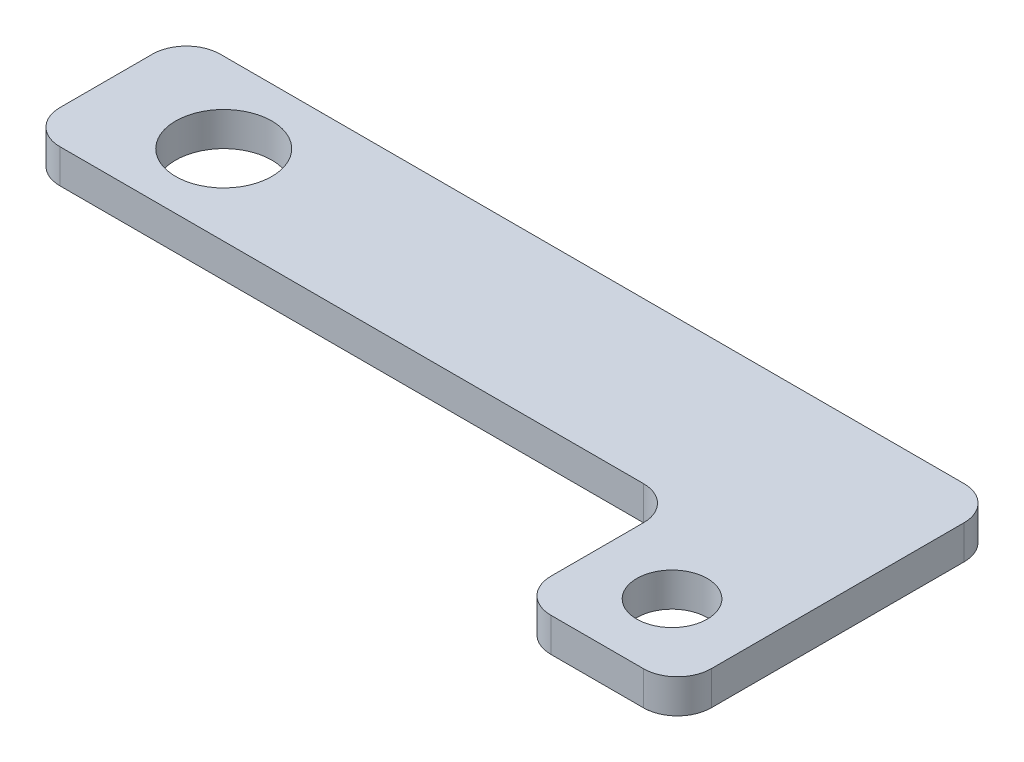
ISO-10303-21;
HEADER;
FILE_DESCRIPTION(('STEP AP214'),'2;1');
FILE_NAME('part.step','',(''),(''),'','','');
FILE_SCHEMA(('AUTOMOTIVE_DESIGN { 1 0 10303 214 1 1 1 1 }'));
ENDSEC;
DATA;
#1=APPLICATION_CONTEXT('core data for automotive mechanical design processes');
#2=APPLICATION_PROTOCOL_DEFINITION('international standard','automotive_design',2000,#1);
#3=PRODUCT_CONTEXT('',#1,'mechanical');
#4=PRODUCT('Part','Part','',(#3));
#5=PRODUCT_RELATED_PRODUCT_CATEGORY('part','',(#4));
#6=PRODUCT_DEFINITION_FORMATION('','',#4);
#7=PRODUCT_DEFINITION_CONTEXT('part definition',#1,'design');
#8=PRODUCT_DEFINITION('design','',#6,#7);
#9=PRODUCT_DEFINITION_SHAPE('','',#8);
#10=(LENGTH_UNIT() NAMED_UNIT(*) SI_UNIT(.MILLI.,.METRE.));
#11=(NAMED_UNIT(*) PLANE_ANGLE_UNIT() SI_UNIT($,.RADIAN.));
#12=(NAMED_UNIT(*) SI_UNIT($,.STERADIAN.) SOLID_ANGLE_UNIT());
#13=UNCERTAINTY_MEASURE_WITH_UNIT(LENGTH_MEASURE(1.E-05),#10,'distance_accuracy_value','');
#14=(GEOMETRIC_REPRESENTATION_CONTEXT(3) GLOBAL_UNCERTAINTY_ASSIGNED_CONTEXT((#13)) GLOBAL_UNIT_ASSIGNED_CONTEXT((#10,
#11,#12)) REPRESENTATION_CONTEXT('',''));
#15=CARTESIAN_POINT('',(0.,0.,0.));
#16=DIRECTION('',(0.,0.,1.));
#17=DIRECTION('',(1.,0.,0.));
#18=AXIS2_PLACEMENT_3D('',#15,#16,#17);
#19=CARTESIAN_POINT('',(56.0000000000009,-3.175,51.0812086000005));
#20=DIRECTION('',(0.,0.,1.));
#21=DIRECTION('',(1.,0.,0.));
#22=AXIS2_PLACEMENT_3D('',#19,#20,#21);
#23=PLANE('',#22);
#24=DIRECTION('',(1.,0.,0.));
#25=VECTOR('',#24,1.);
#26=CARTESIAN_POINT('',(56.0000000000009,-3.175,51.0812086000005));
#27=LINE('',#26,#25);
#28=CARTESIAN_POINT('',(59.1750000000009,-3.175,51.0812086000005));
#29=VERTEX_POINT('',#28);
#30=CARTESIAN_POINT('',(67.8250000000009,-3.175,51.0812086000005));
#31=VERTEX_POINT('',#30);
#32=EDGE_CURVE('E158',#29,#31,#27,.T.);
#33=ORIENTED_EDGE('',*,*,#32,.T.);
#34=DIRECTION('',(0.,1.,0.));
#35=VECTOR('',#34,1.);
#36=CARTESIAN_POINT('',(67.8250000000009,-3.175,51.0812086000005));
#37=LINE('',#36,#35);
#38=CARTESIAN_POINT('',(67.8250000000009,0.,51.0812086000005));
#39=VERTEX_POINT('',#38);
#40=EDGE_CURVE('E202',#31,#39,#37,.T.);
#41=ORIENTED_EDGE('',*,*,#40,.T.);
#42=DIRECTION('',(1.,0.,0.));
#43=VECTOR('',#42,1.);
#44=CARTESIAN_POINT('',(56.0000000000009,0.,51.0812086000005));
#45=LINE('',#44,#43);
#46=CARTESIAN_POINT('',(59.1750000000009,0.,51.0812086000005));
#47=VERTEX_POINT('',#46);
#48=EDGE_CURVE('E136',#47,#39,#45,.T.);
#49=ORIENTED_EDGE('',*,*,#48,.F.);
#50=DIRECTION('',(0.,1.,0.));
#51=VECTOR('',#50,1.);
#52=CARTESIAN_POINT('',(59.1750000000009,-3.175,51.0812086000005));
#53=LINE('',#52,#51);
#54=EDGE_CURVE('E200',#47,#29,#53,.F.);
#55=ORIENTED_EDGE('',*,*,#54,.T.);
#56=EDGE_LOOP('',(#33,#41,#49,#55));
#57=FACE_BOUND('',#56,.T.);
#58=ADVANCED_FACE('F41',(#57),#23,.T.);
#59=CARTESIAN_POINT('',(56.0000000000009,-3.175,44.0812086000005));
#60=DIRECTION('',(-1.,0.,0.));
#61=DIRECTION('',(0.,0.,1.));
#62=AXIS2_PLACEMENT_3D('',#59,#60,#61);
#63=PLANE('',#62);
#64=DIRECTION('',(0.,0.,1.));
#65=VECTOR('',#64,1.);
#66=CARTESIAN_POINT('',(56.0000000000009,0.,44.0812086000005));
#67=LINE('',#66,#65);
#68=CARTESIAN_POINT('',(56.0000000000009,0.,39.2562086000001));
#69=VERTEX_POINT('',#68);
#70=CARTESIAN_POINT('',(56.0000000000009,0.,47.9062086000005));
#71=VERTEX_POINT('',#70);
#72=EDGE_CURVE('E206',#69,#71,#67,.T.);
#73=ORIENTED_EDGE('',*,*,#72,.F.);
#74=DIRECTION('',(0.,1.,0.));
#75=VECTOR('',#74,1.);
#76=CARTESIAN_POINT('',(56.0000000000009,-3.175,39.2562086000001));
#77=LINE('',#76,#75);
#78=CARTESIAN_POINT('',(56.0000000000009,-3.175,39.2562086000001));
#79=VERTEX_POINT('',#78);
#80=EDGE_CURVE('E198',#69,#79,#77,.F.);
#81=ORIENTED_EDGE('',*,*,#80,.T.);
#82=DIRECTION('',(0.,0.,1.));
#83=VECTOR('',#82,1.);
#84=CARTESIAN_POINT('',(56.0000000000009,-3.175,36.0812086000001));
#85=LINE('',#84,#83);
#86=CARTESIAN_POINT('',(56.0000000000009,-3.175,47.9062086000005));
#87=VERTEX_POINT('',#86);
#88=EDGE_CURVE('E162',#79,#87,#85,.T.);
#89=ORIENTED_EDGE('',*,*,#88,.T.);
#90=DIRECTION('',(0.,1.,0.));
#91=VECTOR('',#90,1.);
#92=CARTESIAN_POINT('',(56.0000000000009,-3.175,47.9062086000005));
#93=LINE('',#92,#91);
#94=EDGE_CURVE('E195',#87,#71,#93,.T.);
#95=ORIENTED_EDGE('',*,*,#94,.T.);
#96=EDGE_LOOP('',(#73,#81,#89,#95));
#97=FACE_BOUND('',#96,.T.);
#98=ADVANCED_FACE('F213',(#97),#63,.T.);
#99=CARTESIAN_POINT('',(6.05000000000337,-3.175,36.0812086000001));
#100=DIRECTION('',(0.,0.,1.));
#101=DIRECTION('',(1.,0.,0.));
#102=AXIS2_PLACEMENT_3D('',#99,#100,#101);
#103=PLANE('',#102);
#104=DIRECTION('',(1.,0.,0.));
#105=VECTOR('',#104,1.);
#106=CARTESIAN_POINT('',(6.05000000000337,0.,36.0812086000001));
#107=LINE('',#106,#105);
#108=CARTESIAN_POINT('',(-1.77499999999663,0.,36.0812086000001));
#109=VERTEX_POINT('',#108);
#110=CARTESIAN_POINT('',(52.8250000000009,0.,36.0812086000001));
#111=VERTEX_POINT('',#110);
#112=EDGE_CURVE('E208',#109,#111,#107,.T.);
#113=ORIENTED_EDGE('',*,*,#112,.F.);
#114=DIRECTION('',(0.,1.,0.));
#115=VECTOR('',#114,1.);
#116=CARTESIAN_POINT('',(-1.77499999999663,-3.175,36.0812086000001));
#117=LINE('',#116,#115);
#118=CARTESIAN_POINT('',(-1.77499999999663,-3.175,36.0812086000001));
#119=VERTEX_POINT('',#118);
#120=EDGE_CURVE('E193',#109,#119,#117,.F.);
#121=ORIENTED_EDGE('',*,*,#120,.T.);
#122=DIRECTION('',(1.,0.,0.));
#123=VECTOR('',#122,1.);
#124=CARTESIAN_POINT('',(-4.94999999999663,-3.175,36.0812086000001));
#125=LINE('',#124,#123);
#126=CARTESIAN_POINT('',(52.8250000000009,-3.175,36.0812086000001));
#127=VERTEX_POINT('',#126);
#128=EDGE_CURVE('E222',#119,#127,#125,.T.);
#129=ORIENTED_EDGE('',*,*,#128,.T.);
#130=DIRECTION('',(0.,1.,0.));
#131=VECTOR('',#130,1.);
#132=CARTESIAN_POINT('',(52.8250000000009,0.,36.0812086000001));
#133=LINE('',#132,#131);
#134=EDGE_CURVE('E190',#127,#111,#133,.T.);
#135=ORIENTED_EDGE('',*,*,#134,.T.);
#136=EDGE_LOOP('',(#113,#121,#129,#135));
#137=FACE_BOUND('',#136,.T.);
#138=ADVANCED_FACE('F224',(#137),#103,.T.);
#139=CARTESIAN_POINT('',(-4.94999999999663,-3.175,21.0812086000001));
#140=DIRECTION('',(-1.,0.,0.));
#141=DIRECTION('',(0.,0.,1.));
#142=AXIS2_PLACEMENT_3D('',#139,#140,#141);
#143=PLANE('',#142);
#144=DIRECTION('',(0.,0.,1.));
#145=VECTOR('',#144,1.);
#146=CARTESIAN_POINT('',(-4.94999999999663,0.,21.0812086000001));
#147=LINE('',#146,#145);
#148=CARTESIAN_POINT('',(-4.94999999999663,0.,24.2562086000001));
#149=VERTEX_POINT('',#148);
#150=CARTESIAN_POINT('',(-4.94999999999663,0.,32.9062086000001));
#151=VERTEX_POINT('',#150);
#152=EDGE_CURVE('E235',#149,#151,#147,.T.);
#153=ORIENTED_EDGE('',*,*,#152,.F.);
#154=DIRECTION('',(0.,1.,0.));
#155=VECTOR('',#154,1.);
#156=CARTESIAN_POINT('',(-4.94999999999663,-3.175,24.2562086000001));
#157=LINE('',#156,#155);
#158=CARTESIAN_POINT('',(-4.94999999999663,-3.175,24.2562086000001));
#159=VERTEX_POINT('',#158);
#160=EDGE_CURVE('E63',#149,#159,#157,.F.);
#161=ORIENTED_EDGE('',*,*,#160,.T.);
#162=DIRECTION('',(0.,0.,1.));
#163=VECTOR('',#162,1.);
#164=CARTESIAN_POINT('',(-4.94999999999663,-3.175,21.0812086000001));
#165=LINE('',#164,#163);
#166=CARTESIAN_POINT('',(-4.94999999999663,-3.175,32.9062086000001));
#167=VERTEX_POINT('',#166);
#168=EDGE_CURVE('E226',#159,#167,#165,.T.);
#169=ORIENTED_EDGE('',*,*,#168,.T.);
#170=DIRECTION('',(0.,1.,0.));
#171=VECTOR('',#170,1.);
#172=CARTESIAN_POINT('',(-4.94999999999663,-3.175,32.9062086000001));
#173=LINE('',#172,#171);
#174=EDGE_CURVE('E186',#167,#151,#173,.T.);
#175=ORIENTED_EDGE('',*,*,#174,.T.);
#176=EDGE_LOOP('',(#153,#161,#169,#175));
#177=FACE_BOUND('',#176,.T.);
#178=ADVANCED_FACE('F238',(#177),#143,.T.);
#179=CARTESIAN_POINT('',(6.05000000000337,-3.175,21.0812086000001));
#180=DIRECTION('',(0.,0.,-1.));
#181=DIRECTION('',(-1.,0.,0.));
#182=AXIS2_PLACEMENT_3D('',#179,#180,#181);
#183=PLANE('',#182);
#184=DIRECTION('',(-1.,0.,0.));
#185=VECTOR('',#184,1.);
#186=CARTESIAN_POINT('',(6.05000000000337,0.,21.0812086000001));
#187=LINE('',#186,#185);
#188=CARTESIAN_POINT('',(67.8250000000009,0.,21.0812086000001));
#189=VERTEX_POINT('',#188);
#190=CARTESIAN_POINT('',(-1.77499999999663,0.,21.0812086000001));
#191=VERTEX_POINT('',#190);
#192=EDGE_CURVE('E152',#189,#191,#187,.T.);
#193=ORIENTED_EDGE('',*,*,#192,.F.);
#194=DIRECTION('',(0.,1.,0.));
#195=VECTOR('',#194,1.);
#196=CARTESIAN_POINT('',(67.8250000000009,-3.175,21.0812086000001));
#197=LINE('',#196,#195);
#198=CARTESIAN_POINT('',(67.8250000000009,-3.175,21.0812086000001));
#199=VERTEX_POINT('',#198);
#200=EDGE_CURVE('E176',#189,#199,#197,.F.);
#201=ORIENTED_EDGE('',*,*,#200,.T.);
#202=DIRECTION('',(-1.,0.,0.));
#203=VECTOR('',#202,1.);
#204=CARTESIAN_POINT('',(6.05000000000337,-3.175,21.0812086000001));
#205=LINE('',#204,#203);
#206=CARTESIAN_POINT('',(-1.77499999999663,-3.175,21.0812086000001));
#207=VERTEX_POINT('',#206);
#208=EDGE_CURVE('E229',#199,#207,#205,.T.);
#209=ORIENTED_EDGE('',*,*,#208,.T.);
#210=DIRECTION('',(0.,1.,0.));
#211=VECTOR('',#210,1.);
#212=CARTESIAN_POINT('',(-1.77499999999663,-3.175,21.0812086000001));
#213=LINE('',#212,#211);
#214=EDGE_CURVE('E173',#207,#191,#213,.T.);
#215=ORIENTED_EDGE('',*,*,#214,.T.);
#216=EDGE_LOOP('',(#193,#201,#209,#215));
#217=FACE_BOUND('',#216,.T.);
#218=ADVANCED_FACE('F248',(#217),#183,.T.);
#219=CARTESIAN_POINT('',(71.0000000000009,-3.175,21.0812086000001));
#220=DIRECTION('',(1.,0.,0.));
#221=DIRECTION('',(0.,0.,-1.));
#222=AXIS2_PLACEMENT_3D('',#219,#220,#221);
#223=PLANE('',#222);
#224=DIRECTION('',(0.,0.,-1.));
#225=VECTOR('',#224,1.);
#226=CARTESIAN_POINT('',(71.0000000000009,-3.175,51.0812086000005));
#227=LINE('',#226,#225);
#228=CARTESIAN_POINT('',(71.0000000000009,-3.175,47.9062086000005));
#229=VERTEX_POINT('',#228);
#230=CARTESIAN_POINT('',(71.0000000000009,-3.175,24.2562086000001));
#231=VERTEX_POINT('',#230);
#232=EDGE_CURVE('E250',#229,#231,#227,.T.);
#233=ORIENTED_EDGE('',*,*,#232,.T.);
#234=DIRECTION('',(0.,1.,0.));
#235=VECTOR('',#234,1.);
#236=CARTESIAN_POINT('',(71.0000000000009,-3.175,24.2562086000001));
#237=LINE('',#236,#235);
#238=CARTESIAN_POINT('',(71.0000000000009,0.,24.2562086000001));
#239=VERTEX_POINT('',#238);
#240=EDGE_CURVE('E151',#231,#239,#237,.T.);
#241=ORIENTED_EDGE('',*,*,#240,.T.);
#242=DIRECTION('',(0.,0.,-1.));
#243=VECTOR('',#242,1.);
#244=CARTESIAN_POINT('',(71.0000000000009,0.,21.0812086000001));
#245=LINE('',#244,#243);
#246=CARTESIAN_POINT('',(71.0000000000009,0.,47.9062086000005));
#247=VERTEX_POINT('',#246);
#248=EDGE_CURVE('E134',#247,#239,#245,.T.);
#249=ORIENTED_EDGE('',*,*,#248,.F.);
#250=DIRECTION('',(0.,1.,0.));
#251=VECTOR('',#250,1.);
#252=CARTESIAN_POINT('',(71.0000000000009,-3.175,47.9062086000005));
#253=LINE('',#252,#251);
#254=EDGE_CURVE('E148',#247,#229,#253,.F.);
#255=ORIENTED_EDGE('',*,*,#254,.T.);
#256=EDGE_LOOP('',(#233,#241,#249,#255));
#257=FACE_BOUND('',#256,.T.);
#258=ADVANCED_FACE('F147',(#257),#223,.T.);
#259=CARTESIAN_POINT('',(0.,-3.175,0.));
#260=DIRECTION('',(0.,-1.,0.));
#261=DIRECTION('',(0.,0.,-1.));
#262=AXIS2_PLACEMENT_3D('',#259,#260,#261);
#263=PLANE('',#262);
#264=CARTESIAN_POINT('',(63.5000000000009,-3.175,44.0812086000005));
#265=DIRECTION('',(0.,-1.,0.));
#266=DIRECTION('',(0.,0.,-1.));
#267=AXIS2_PLACEMENT_3D('',#264,#265,#266);
#268=CIRCLE('',#267,3.3);
#269=CARTESIAN_POINT('',(63.5000000000009,-3.175,40.7812086000005));
#270=VERTEX_POINT('',#269);
#271=EDGE_CURVE('E261',#270,#270,#268,.T.);
#272=ORIENTED_EDGE('',*,*,#271,.F.);
#273=EDGE_LOOP('',(#272));
#274=FACE_BOUND('',#273,.T.);
#275=CARTESIAN_POINT('',(6.05000000000337,-3.175,28.5812086000001));
#276=DIRECTION('',(0.,-1.,0.));
#277=DIRECTION('',(0.,0.,-1.));
#278=AXIS2_PLACEMENT_3D('',#275,#276,#277);
#279=CIRCLE('',#278,4.5);
#280=CARTESIAN_POINT('',(6.05000000000337,-3.175,24.0812086000001));
#281=VERTEX_POINT('',#280);
#282=EDGE_CURVE('E255',#281,#281,#279,.T.);
#283=ORIENTED_EDGE('',*,*,#282,.F.);
#284=EDGE_LOOP('',(#283));
#285=FACE_BOUND('',#284,.T.);
#286=ORIENTED_EDGE('',*,*,#208,.F.);
#287=CARTESIAN_POINT('',(67.8250000000009,-3.175,24.2562086000001));
#288=DIRECTION('',(0.,-1.,0.));
#289=DIRECTION('',(0.,0.,-1.));
#290=AXIS2_PLACEMENT_3D('',#287,#288,#289);
#291=CIRCLE('',#290,3.175);
#292=EDGE_CURVE('E184',#199,#231,#291,.T.);
#293=ORIENTED_EDGE('',*,*,#292,.T.);
#294=ORIENTED_EDGE('',*,*,#232,.F.);
#295=CARTESIAN_POINT('',(67.8250000000009,-3.175,47.9062086000005));
#296=DIRECTION('',(0.,-1.,0.));
#297=DIRECTION('',(0.,0.,-1.));
#298=AXIS2_PLACEMENT_3D('',#295,#296,#297);
#299=CIRCLE('',#298,3.175);
#300=EDGE_CURVE('E157',#229,#31,#299,.T.);
#301=ORIENTED_EDGE('',*,*,#300,.T.);
#302=ORIENTED_EDGE('',*,*,#32,.F.);
#303=CARTESIAN_POINT('',(59.1750000000009,-3.175,47.9062086000005));
#304=DIRECTION('',(0.,-1.,0.));
#305=DIRECTION('',(0.,0.,-1.));
#306=AXIS2_PLACEMENT_3D('',#303,#304,#305);
#307=CIRCLE('',#306,3.175);
#308=EDGE_CURVE('E178',#29,#87,#307,.T.);
#309=ORIENTED_EDGE('',*,*,#308,.T.);
#310=ORIENTED_EDGE('',*,*,#88,.F.);
#311=CARTESIAN_POINT('',(52.8250000000009,-3.175,39.2562086000001));
#312=DIRECTION('',(0.,-1.,0.));
#313=DIRECTION('',(0.,0.,-1.));
#314=AXIS2_PLACEMENT_3D('',#311,#312,#313);
#315=CIRCLE('',#314,3.175);
#316=EDGE_CURVE('E11',#79,#127,#315,.F.);
#317=ORIENTED_EDGE('',*,*,#316,.T.);
#318=ORIENTED_EDGE('',*,*,#128,.F.);
#319=CARTESIAN_POINT('',(-1.77499999999663,-3.175,32.9062086000001));
#320=DIRECTION('',(0.,-1.,0.));
#321=DIRECTION('',(0.,0.,-1.));
#322=AXIS2_PLACEMENT_3D('',#319,#320,#321);
#323=CIRCLE('',#322,3.175);
#324=EDGE_CURVE('E56',#119,#167,#323,.T.);
#325=ORIENTED_EDGE('',*,*,#324,.T.);
#326=ORIENTED_EDGE('',*,*,#168,.F.);
#327=CARTESIAN_POINT('',(-1.77499999999663,-3.175,24.2562086000001));
#328=DIRECTION('',(0.,-1.,0.));
#329=DIRECTION('',(0.,0.,-1.));
#330=AXIS2_PLACEMENT_3D('',#327,#328,#329);
#331=CIRCLE('',#330,3.175);
#332=EDGE_CURVE('E182',#159,#207,#331,.T.);
#333=ORIENTED_EDGE('',*,*,#332,.T.);
#334=EDGE_LOOP('',(#286,#293,#294,#301,#302,#309,#310,#317,#318,#325,#326,#333));
#335=FACE_BOUND('',#334,.T.);
#336=ADVANCED_FACE('F221',(#274,#285,#335),#263,.T.);
#337=CARTESIAN_POINT('',(0.,0.,0.));
#338=DIRECTION('',(0.,-1.,0.));
#339=DIRECTION('',(0.,0.,-1.));
#340=AXIS2_PLACEMENT_3D('',#337,#338,#339);
#341=PLANE('',#340);
#342=CARTESIAN_POINT('',(63.5000000000009,0.,44.0812086000005));
#343=DIRECTION('',(0.,-1.,0.));
#344=DIRECTION('',(0.,0.,-1.));
#345=AXIS2_PLACEMENT_3D('',#342,#343,#344);
#346=CIRCLE('',#345,3.3);
#347=CARTESIAN_POINT('',(63.5000000000009,0.,40.7812086000005));
#348=VERTEX_POINT('',#347);
#349=EDGE_CURVE('E258',#348,#348,#346,.T.);
#350=ORIENTED_EDGE('',*,*,#349,.T.);
#351=EDGE_LOOP('',(#350));
#352=FACE_BOUND('',#351,.T.);
#353=CARTESIAN_POINT('',(6.05000000000337,0.,28.5812086000001));
#354=DIRECTION('',(0.,-1.,0.));
#355=DIRECTION('',(0.,0.,-1.));
#356=AXIS2_PLACEMENT_3D('',#353,#354,#355);
#357=CIRCLE('',#356,4.5);
#358=CARTESIAN_POINT('',(6.05000000000337,0.,24.0812086000001));
#359=VERTEX_POINT('',#358);
#360=EDGE_CURVE('E153',#359,#359,#357,.T.);
#361=ORIENTED_EDGE('',*,*,#360,.T.);
#362=EDGE_LOOP('',(#361));
#363=FACE_BOUND('',#362,.T.);
#364=ORIENTED_EDGE('',*,*,#248,.T.);
#365=CARTESIAN_POINT('',(67.8250000000009,0.,24.2562086000001));
#366=DIRECTION('',(0.,-1.,0.));
#367=DIRECTION('',(0.,0.,-1.));
#368=AXIS2_PLACEMENT_3D('',#365,#366,#367);
#369=CIRCLE('',#368,3.175);
#370=EDGE_CURVE('E171',#239,#189,#369,.F.);
#371=ORIENTED_EDGE('',*,*,#370,.T.);
#372=ORIENTED_EDGE('',*,*,#192,.T.);
#373=CARTESIAN_POINT('',(-1.77499999999663,0.,24.2562086000001));
#374=DIRECTION('',(0.,-1.,0.));
#375=DIRECTION('',(0.,0.,-1.));
#376=AXIS2_PLACEMENT_3D('',#373,#374,#375);
#377=CIRCLE('',#376,3.175);
#378=EDGE_CURVE('E169',#191,#149,#377,.F.);
#379=ORIENTED_EDGE('',*,*,#378,.T.);
#380=ORIENTED_EDGE('',*,*,#152,.T.);
#381=CARTESIAN_POINT('',(-1.77499999999663,0.,32.9062086000001));
#382=DIRECTION('',(0.,-1.,0.));
#383=DIRECTION('',(0.,0.,-1.));
#384=AXIS2_PLACEMENT_3D('',#381,#382,#383);
#385=CIRCLE('',#384,3.175);
#386=EDGE_CURVE('E141',#151,#109,#385,.F.);
#387=ORIENTED_EDGE('',*,*,#386,.T.);
#388=ORIENTED_EDGE('',*,*,#112,.T.);
#389=CARTESIAN_POINT('',(52.8250000000009,0.,39.2562086000001));
#390=DIRECTION('',(0.,-1.,0.));
#391=DIRECTION('',(0.,0.,-1.));
#392=AXIS2_PLACEMENT_3D('',#389,#390,#391);
#393=CIRCLE('',#392,3.175);
#394=EDGE_CURVE('E49',#111,#69,#393,.T.);
#395=ORIENTED_EDGE('',*,*,#394,.T.);
#396=ORIENTED_EDGE('',*,*,#72,.T.);
#397=CARTESIAN_POINT('',(59.1750000000009,0.,47.9062086000005));
#398=DIRECTION('',(0.,-1.,0.));
#399=DIRECTION('',(0.,0.,-1.));
#400=AXIS2_PLACEMENT_3D('',#397,#398,#399);
#401=CIRCLE('',#400,3.175);
#402=EDGE_CURVE('E142',#71,#47,#401,.F.);
#403=ORIENTED_EDGE('',*,*,#402,.T.);
#404=ORIENTED_EDGE('',*,*,#48,.T.);
#405=CARTESIAN_POINT('',(67.8250000000009,0.,47.9062086000005));
#406=DIRECTION('',(0.,-1.,0.));
#407=DIRECTION('',(0.,0.,-1.));
#408=AXIS2_PLACEMENT_3D('',#405,#406,#407);
#409=CIRCLE('',#408,3.175);
#410=EDGE_CURVE('E131',#39,#247,#409,.F.);
#411=ORIENTED_EDGE('',*,*,#410,.T.);
#412=EDGE_LOOP('',(#364,#371,#372,#379,#380,#387,#388,#395,#396,#403,#404,#411));
#413=FACE_BOUND('',#412,.T.);
#414=ADVANCED_FACE('F133',(#352,#363,#413),#341,.F.);
#415=CARTESIAN_POINT('',(6.05000000000337,-3.175,28.5812086000001));
#416=DIRECTION('',(0.,-1.,0.));
#417=DIRECTION('',(0.,0.,-1.));
#418=AXIS2_PLACEMENT_3D('',#415,#416,#417);
#419=CYLINDRICAL_SURFACE('',#418,4.5);
#420=ORIENTED_EDGE('',*,*,#360,.F.);
#421=EDGE_LOOP('',(#420));
#422=FACE_BOUND('',#421,.T.);
#423=ORIENTED_EDGE('',*,*,#282,.T.);
#424=EDGE_LOOP('',(#423));
#425=FACE_BOUND('',#424,.T.);
#426=ADVANCED_FACE('F272',(#422,#425),#419,.F.);
#427=CARTESIAN_POINT('',(63.5000000000009,-3.175,44.0812086000005));
#428=DIRECTION('',(0.,-1.,0.));
#429=DIRECTION('',(0.,0.,-1.));
#430=AXIS2_PLACEMENT_3D('',#427,#428,#429);
#431=CYLINDRICAL_SURFACE('',#430,3.3);
#432=ORIENTED_EDGE('',*,*,#349,.F.);
#433=EDGE_LOOP('',(#432));
#434=FACE_BOUND('',#433,.T.);
#435=ORIENTED_EDGE('',*,*,#271,.T.);
#436=EDGE_LOOP('',(#435));
#437=FACE_BOUND('',#436,.T.);
#438=ADVANCED_FACE('F265',(#434,#437),#431,.F.);
#439=CARTESIAN_POINT('',(67.8250000000009,-3.175,24.2562086000001));
#440=DIRECTION('',(0.,1.,0.));
#441=DIRECTION('',(0.,0.,1.));
#442=AXIS2_PLACEMENT_3D('',#439,#440,#441);
#443=CYLINDRICAL_SURFACE('',#442,3.175);
#444=ORIENTED_EDGE('',*,*,#292,.F.);
#445=ORIENTED_EDGE('',*,*,#200,.F.);
#446=ORIENTED_EDGE('',*,*,#370,.F.);
#447=ORIENTED_EDGE('',*,*,#240,.F.);
#448=EDGE_LOOP('',(#444,#445,#446,#447));
#449=FACE_BOUND('',#448,.T.);
#450=ADVANCED_FACE('F279',(#449),#443,.T.);
#451=CARTESIAN_POINT('',(-1.77499999999663,-3.175,24.2562086000001));
#452=DIRECTION('',(0.,1.,0.));
#453=DIRECTION('',(0.,0.,1.));
#454=AXIS2_PLACEMENT_3D('',#451,#452,#453);
#455=CYLINDRICAL_SURFACE('',#454,3.175);
#456=ORIENTED_EDGE('',*,*,#332,.F.);
#457=ORIENTED_EDGE('',*,*,#160,.F.);
#458=ORIENTED_EDGE('',*,*,#378,.F.);
#459=ORIENTED_EDGE('',*,*,#214,.F.);
#460=EDGE_LOOP('',(#456,#457,#458,#459));
#461=FACE_BOUND('',#460,.T.);
#462=ADVANCED_FACE('F242',(#461),#455,.T.);
#463=CARTESIAN_POINT('',(-1.77499999999663,-3.175,32.9062086000001));
#464=DIRECTION('',(0.,1.,0.));
#465=DIRECTION('',(0.,0.,1.));
#466=AXIS2_PLACEMENT_3D('',#463,#464,#465);
#467=CYLINDRICAL_SURFACE('',#466,3.175);
#468=ORIENTED_EDGE('',*,*,#324,.F.);
#469=ORIENTED_EDGE('',*,*,#120,.F.);
#470=ORIENTED_EDGE('',*,*,#386,.F.);
#471=ORIENTED_EDGE('',*,*,#174,.F.);
#472=EDGE_LOOP('',(#468,#469,#470,#471));
#473=FACE_BOUND('',#472,.T.);
#474=ADVANCED_FACE('F307',(#473),#467,.T.);
#475=CARTESIAN_POINT('',(52.8250000000009,-3.175,39.2562086000001));
#476=DIRECTION('',(0.,-1.,0.));
#477=DIRECTION('',(0.,0.,-1.));
#478=AXIS2_PLACEMENT_3D('',#475,#476,#477);
#479=CYLINDRICAL_SURFACE('',#478,3.175);
#480=ORIENTED_EDGE('',*,*,#316,.F.);
#481=ORIENTED_EDGE('',*,*,#80,.F.);
#482=ORIENTED_EDGE('',*,*,#394,.F.);
#483=ORIENTED_EDGE('',*,*,#134,.F.);
#484=EDGE_LOOP('',(#480,#481,#482,#483));
#485=FACE_BOUND('',#484,.T.);
#486=ADVANCED_FACE('F218',(#485),#479,.F.);
#487=CARTESIAN_POINT('',(67.8250000000009,-3.175,47.9062086000005));
#488=DIRECTION('',(0.,1.,0.));
#489=DIRECTION('',(0.,0.,1.));
#490=AXIS2_PLACEMENT_3D('',#487,#488,#489);
#491=CYLINDRICAL_SURFACE('',#490,3.175);
#492=ORIENTED_EDGE('',*,*,#300,.F.);
#493=ORIENTED_EDGE('',*,*,#254,.F.);
#494=ORIENTED_EDGE('',*,*,#410,.F.);
#495=ORIENTED_EDGE('',*,*,#40,.F.);
#496=EDGE_LOOP('',(#492,#493,#494,#495));
#497=FACE_BOUND('',#496,.T.);
#498=ADVANCED_FACE('F156',(#497),#491,.T.);
#499=CARTESIAN_POINT('',(59.1750000000009,-3.175,47.9062086000005));
#500=DIRECTION('',(0.,1.,0.));
#501=DIRECTION('',(0.,0.,1.));
#502=AXIS2_PLACEMENT_3D('',#499,#500,#501);
#503=CYLINDRICAL_SURFACE('',#502,3.175);
#504=ORIENTED_EDGE('',*,*,#308,.F.);
#505=ORIENTED_EDGE('',*,*,#54,.F.);
#506=ORIENTED_EDGE('',*,*,#402,.F.);
#507=ORIENTED_EDGE('',*,*,#94,.F.);
#508=EDGE_LOOP('',(#504,#505,#506,#507));
#509=FACE_BOUND('',#508,.T.);
#510=ADVANCED_FACE('F43',(#509),#503,.T.);
#511=CLOSED_SHELL('',(#58,#98,#138,#178,#218,#258,#336,#414,#426,#438,#450,#462,#474,#486,#498,#510));
#512=MANIFOLD_SOLID_BREP('B2',#511);
#513=ADVANCED_BREP_SHAPE_REPRESENTATION('',(#18,#512),#14);
#514=SHAPE_DEFINITION_REPRESENTATION(#9,#513);
ENDSEC;
END-ISO-10303-21;
